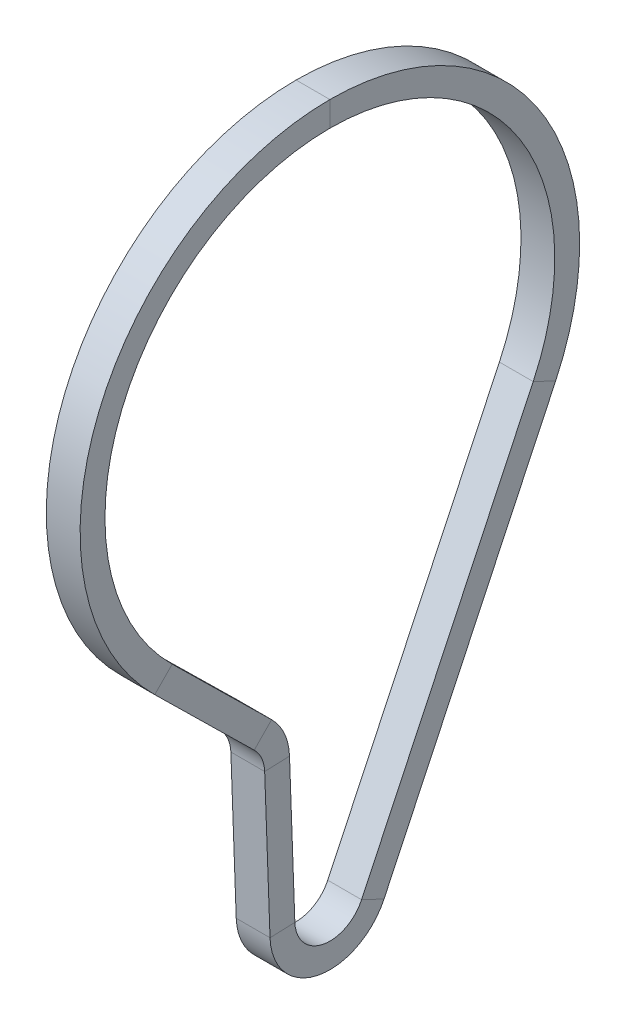
ISO-10303-21;
HEADER;
FILE_DESCRIPTION(('STEP AP214'),'2;1');
FILE_NAME('part.step','',(''),(''),'','','');
FILE_SCHEMA(('AUTOMOTIVE_DESIGN { 1 0 10303 214 1 1 1 1 }'));
ENDSEC;
DATA;
#1=APPLICATION_CONTEXT('core data for automotive mechanical design processes');
#2=APPLICATION_PROTOCOL_DEFINITION('international standard','automotive_design',2000,#1);
#3=PRODUCT_CONTEXT('',#1,'mechanical');
#4=PRODUCT('Part','Part','',(#3));
#5=PRODUCT_RELATED_PRODUCT_CATEGORY('part','',(#4));
#6=PRODUCT_DEFINITION_FORMATION('','',#4);
#7=PRODUCT_DEFINITION_CONTEXT('part definition',#1,'design');
#8=PRODUCT_DEFINITION('design','',#6,#7);
#9=PRODUCT_DEFINITION_SHAPE('','',#8);
#10=(LENGTH_UNIT() NAMED_UNIT(*) SI_UNIT(.MILLI.,.METRE.));
#11=(NAMED_UNIT(*) PLANE_ANGLE_UNIT() SI_UNIT($,.RADIAN.));
#12=(NAMED_UNIT(*) SI_UNIT($,.STERADIAN.) SOLID_ANGLE_UNIT());
#13=UNCERTAINTY_MEASURE_WITH_UNIT(LENGTH_MEASURE(1.E-05),#10,'distance_accuracy_value','');
#14=(GEOMETRIC_REPRESENTATION_CONTEXT(3) GLOBAL_UNCERTAINTY_ASSIGNED_CONTEXT((#13)) GLOBAL_UNIT_ASSIGNED_CONTEXT((#10,
#11,#12)) REPRESENTATION_CONTEXT('',''));
#15=CARTESIAN_POINT('',(0.,0.,0.));
#16=DIRECTION('',(0.,0.,1.));
#17=DIRECTION('',(1.,0.,0.));
#18=AXIS2_PLACEMENT_3D('',#15,#16,#17);
#19=CARTESIAN_POINT('',(-6.477,-68.2533357957576,67.1097191214092));
#20=DIRECTION('',(1.,0.,0.));
#21=DIRECTION('',(0.,0.,-1.));
#22=AXIS2_PLACEMENT_3D('',#19,#20,#21);
#23=PLANE('',#22);
#24=DIRECTION('',(0.,0.713055335217779,-0.70110775842053));
#25=VECTOR('',#24,1.);
#26=CARTESIAN_POINT('',(-6.477,-68.2533357957576,67.1097191214092));
#27=LINE('',#26,#25);
#28=CARTESIAN_POINT('',(-6.477,-68.2533357957576,67.1097191214092));
#29=VERTEX_POINT('',#28);
#30=CARTESIAN_POINT('',(-6.477,-61.4614837278083,60.4316677224536));
#31=VERTEX_POINT('',#30);
#32=EDGE_CURVE('E192',#29,#31,#27,.T.);
#33=ORIENTED_EDGE('',*,*,#32,.F.);
#34=CARTESIAN_POINT('',(-6.477,0.,0.));
#35=DIRECTION('',(-1.,0.,0.));
#36=DIRECTION('',(0.,-0.713055335217778,0.701107758420531));
#37=AXIS2_PLACEMENT_3D('',#34,#35,#36);
#38=CIRCLE('',#37,95.7195499770182);
#39=CARTESIAN_POINT('',(-6.477,95.7195499770182,0.));
#40=VERTEX_POINT('',#39);
#41=EDGE_CURVE('E191',#29,#40,#38,.T.);
#42=ORIENTED_EDGE('',*,*,#41,.T.);
#43=DIRECTION('',(0.,-1.,0.));
#44=VECTOR('',#43,1.);
#45=CARTESIAN_POINT('',(-6.477,95.7195499770182,0.));
#46=LINE('',#45,#44);
#47=CARTESIAN_POINT('',(-6.477,86.1945499770182,0.));
#48=VERTEX_POINT('',#47);
#49=EDGE_CURVE('E166',#40,#48,#46,.T.);
#50=ORIENTED_EDGE('',*,*,#49,.T.);
#51=CARTESIAN_POINT('',(-6.477,0.,0.));
#52=DIRECTION('',(-1.,0.,0.));
#53=DIRECTION('',(0.,-0.713055335217778,0.701107758420531));
#54=AXIS2_PLACEMENT_3D('',#51,#52,#53);
#55=CIRCLE('',#54,86.1945499770182);
#56=EDGE_CURVE('E196',#31,#48,#55,.T.);
#57=ORIENTED_EDGE('',*,*,#56,.F.);
#58=EDGE_LOOP('',(#33,#42,#50,#57));
#59=FACE_BOUND('',#58,.T.);
#60=ADVANCED_FACE('F34',(#59),#23,.F.);
#61=CARTESIAN_POINT('',(-6.477,95.7195499770182,0.));
#62=DIRECTION('',(1.,0.,0.));
#63=DIRECTION('',(0.,0.,-1.));
#64=AXIS2_PLACEMENT_3D('',#61,#62,#63);
#65=PLANE('',#64);
#66=CARTESIAN_POINT('',(-6.477,0.,0.));
#67=DIRECTION('',(-1.,0.,0.));
#68=DIRECTION('',(0.,1.,0.));
#69=AXIS2_PLACEMENT_3D('',#66,#67,#68);
#70=CIRCLE('',#69,86.1945499770182);
#71=CARTESIAN_POINT('',(-6.477,-36.8551039605418,-77.9179167958073));
#72=VERTEX_POINT('',#71);
#73=EDGE_CURVE('E172',#48,#72,#70,.T.);
#74=ORIENTED_EDGE('',*,*,#73,.F.);
#75=ORIENTED_EDGE('',*,*,#49,.F.);
#76=CARTESIAN_POINT('',(-6.477,0.,0.));
#77=DIRECTION('',(-1.,0.,0.));
#78=DIRECTION('',(0.,1.,0.));
#79=AXIS2_PLACEMENT_3D('',#76,#77,#78);
#80=CIRCLE('',#79,95.7195499770182);
#81=CARTESIAN_POINT('',(-6.477,-40.927807690856,-86.5283006040405));
#82=VERTEX_POINT('',#81);
#83=EDGE_CURVE('E170',#40,#82,#80,.T.);
#84=ORIENTED_EDGE('',*,*,#83,.T.);
#85=DIRECTION('',(0.,0.42758044412748,0.903977302701648));
#86=VECTOR('',#85,1.);
#87=CARTESIAN_POINT('',(-6.477,-40.927807690856,-86.5283006040405));
#88=LINE('',#87,#86);
#89=EDGE_CURVE('E188',#82,#72,#88,.T.);
#90=ORIENTED_EDGE('',*,*,#89,.T.);
#91=EDGE_LOOP('',(#74,#75,#84,#90));
#92=FACE_BOUND('',#91,.T.);
#93=ADVANCED_FACE('F168',(#92),#65,.F.);
#94=CARTESIAN_POINT('',(0.,0.,0.));
#95=DIRECTION('',(-1.,0.,0.));
#96=DIRECTION('',(0.,0.,1.));
#97=AXIS2_PLACEMENT_3D('',#94,#95,#96);
#98=CYLINDRICAL_SURFACE('',#97,86.1945499770182);
#99=CARTESIAN_POINT('',(6.477,0.,0.));
#100=DIRECTION('',(-1.,0.,0.));
#101=DIRECTION('',(0.,1.,0.));
#102=AXIS2_PLACEMENT_3D('',#99,#100,#101);
#103=CIRCLE('',#102,86.1945499770182);
#104=CARTESIAN_POINT('',(6.477,86.1945499770182,0.));
#105=VERTEX_POINT('',#104);
#106=CARTESIAN_POINT('',(6.477,-36.8551039605418,-77.9179167958073));
#107=VERTEX_POINT('',#106);
#108=EDGE_CURVE('E243',#105,#107,#103,.T.);
#109=ORIENTED_EDGE('',*,*,#108,.F.);
#110=DIRECTION('',(1.,0.,0.));
#111=VECTOR('',#110,1.);
#112=CARTESIAN_POINT('',(-6.477,86.1945499770182,0.));
#113=LINE('',#112,#111);
#114=EDGE_CURVE('E177',#48,#105,#113,.T.);
#115=ORIENTED_EDGE('',*,*,#114,.F.);
#116=ORIENTED_EDGE('',*,*,#73,.T.);
#117=DIRECTION('',(1.,0.,0.));
#118=VECTOR('',#117,1.);
#119=CARTESIAN_POINT('',(-6.477,-36.8551039605417,-77.9179167958073));
#120=LINE('',#119,#118);
#121=EDGE_CURVE('E289',#72,#107,#120,.T.);
#122=ORIENTED_EDGE('',*,*,#121,.T.);
#123=EDGE_LOOP('',(#109,#115,#116,#122));
#124=FACE_BOUND('',#123,.T.);
#125=ADVANCED_FACE('F317',(#124),#98,.F.);
#126=CARTESIAN_POINT('',(6.477,95.7195499770182,0.));
#127=DIRECTION('',(-1.,0.,0.));
#128=DIRECTION('',(0.,0.,1.));
#129=AXIS2_PLACEMENT_3D('',#126,#127,#128);
#130=PLANE('',#129);
#131=CARTESIAN_POINT('',(6.477,0.,0.));
#132=DIRECTION('',(-1.,0.,0.));
#133=DIRECTION('',(0.,1.,0.));
#134=AXIS2_PLACEMENT_3D('',#131,#132,#133);
#135=CIRCLE('',#134,95.7195499770182);
#136=CARTESIAN_POINT('',(6.477,95.7195499770182,0.));
#137=VERTEX_POINT('',#136);
#138=CARTESIAN_POINT('',(6.477,-40.927807690856,-86.5283006040405));
#139=VERTEX_POINT('',#138);
#140=EDGE_CURVE('E207',#137,#139,#135,.T.);
#141=ORIENTED_EDGE('',*,*,#140,.F.);
#142=DIRECTION('',(0.,1.,0.));
#143=VECTOR('',#142,1.);
#144=CARTESIAN_POINT('',(6.477,95.7195499770182,0.));
#145=LINE('',#144,#143);
#146=EDGE_CURVE('E199',#105,#137,#145,.T.);
#147=ORIENTED_EDGE('',*,*,#146,.F.);
#148=ORIENTED_EDGE('',*,*,#108,.T.);
#149=DIRECTION('',(0.,-0.42758044412748,-0.903977302701648));
#150=VECTOR('',#149,1.);
#151=CARTESIAN_POINT('',(6.477,-40.927807690856,-86.5283006040405));
#152=LINE('',#151,#150);
#153=EDGE_CURVE('E246',#107,#139,#152,.T.);
#154=ORIENTED_EDGE('',*,*,#153,.T.);
#155=EDGE_LOOP('',(#141,#147,#148,#154));
#156=FACE_BOUND('',#155,.T.);
#157=ADVANCED_FACE('F241',(#156),#130,.F.);
#158=CARTESIAN_POINT('',(0.,0.,0.));
#159=DIRECTION('',(-1.,0.,0.));
#160=DIRECTION('',(0.,0.,1.));
#161=AXIS2_PLACEMENT_3D('',#158,#159,#160);
#162=CYLINDRICAL_SURFACE('',#161,95.7195499770182);
#163=DIRECTION('',(-1.,0.,0.));
#164=VECTOR('',#163,1.);
#165=CARTESIAN_POINT('',(-6.477,-40.927807690856,-86.5283006040405));
#166=LINE('',#165,#164);
#167=EDGE_CURVE('E186',#139,#82,#166,.T.);
#168=ORIENTED_EDGE('',*,*,#167,.T.);
#169=ORIENTED_EDGE('',*,*,#83,.F.);
#170=DIRECTION('',(-1.,0.,0.));
#171=VECTOR('',#170,1.);
#172=CARTESIAN_POINT('',(-6.477,95.7195499770182,0.));
#173=LINE('',#172,#171);
#174=EDGE_CURVE('E184',#137,#40,#173,.T.);
#175=ORIENTED_EDGE('',*,*,#174,.F.);
#176=ORIENTED_EDGE('',*,*,#140,.T.);
#177=EDGE_LOOP('',(#168,#169,#175,#176));
#178=FACE_BOUND('',#177,.T.);
#179=ADVANCED_FACE('F182',(#178),#162,.T.);
#180=CARTESIAN_POINT('',(-6.477,-40.927807690856,-86.5283006040405));
#181=DIRECTION('',(1.,0.,0.));
#182=DIRECTION('',(0.,0.,-1.));
#183=AXIS2_PLACEMENT_3D('',#180,#181,#182);
#184=PLANE('',#183);
#185=DIRECTION('',(0.,-0.903977302701648,0.42758044412748));
#186=VECTOR('',#185,1.);
#187=CARTESIAN_POINT('',(-6.477,-36.8551039605417,-77.9179167958073));
#188=LINE('',#187,#186);
#189=CARTESIAN_POINT('',(-6.477,-175.921939299983,-12.1394298358682));
#190=VERTEX_POINT('',#189);
#191=EDGE_CURVE('E295',#72,#190,#188,.T.);
#192=ORIENTED_EDGE('',*,*,#191,.F.);
#193=ORIENTED_EDGE('',*,*,#89,.F.);
#194=DIRECTION('',(0.,-0.903977302701648,0.42758044412748));
#195=VECTOR('',#194,1.);
#196=CARTESIAN_POINT('',(-6.477,-40.927807690856,-86.5283006040405));
#197=LINE('',#196,#195);
#198=CARTESIAN_POINT('',(-6.477,-179.994643030297,-20.7498136441014));
#199=VERTEX_POINT('',#198);
#200=EDGE_CURVE('E206',#82,#199,#197,.T.);
#201=ORIENTED_EDGE('',*,*,#200,.T.);
#202=DIRECTION('',(0.,0.42758044412748,0.903977302701648));
#203=VECTOR('',#202,1.);
#204=CARTESIAN_POINT('',(-6.477,-179.994643030297,-20.7498136441014));
#205=LINE('',#204,#203);
#206=EDGE_CURVE('E335',#199,#190,#205,.T.);
#207=ORIENTED_EDGE('',*,*,#206,.T.);
#208=EDGE_LOOP('',(#192,#193,#201,#207));
#209=FACE_BOUND('',#208,.T.);
#210=ADVANCED_FACE('F386',(#209),#184,.F.);
#211=CARTESIAN_POINT('',(-6.477,-36.8551039605417,-77.9179167958073));
#212=DIRECTION('',(0.,-0.42758044412748,-0.903977302701648));
#213=DIRECTION('',(0.,0.903977302701648,-0.42758044412748));
#214=AXIS2_PLACEMENT_3D('',#211,#212,#213);
#215=PLANE('',#214);
#216=DIRECTION('',(0.,-0.903977302701648,0.42758044412748));
#217=VECTOR('',#216,1.);
#218=CARTESIAN_POINT('',(6.477,-36.8551039605417,-77.9179167958073));
#219=LINE('',#218,#217);
#220=CARTESIAN_POINT('',(6.477,-175.921939299983,-12.1394298358682));
#221=VERTEX_POINT('',#220);
#222=EDGE_CURVE('E254',#107,#221,#219,.T.);
#223=ORIENTED_EDGE('',*,*,#222,.F.);
#224=ORIENTED_EDGE('',*,*,#121,.F.);
#225=ORIENTED_EDGE('',*,*,#191,.T.);
#226=DIRECTION('',(1.,0.,0.));
#227=VECTOR('',#226,1.);
#228=CARTESIAN_POINT('',(-6.477,-175.921939299983,-12.1394298358682));
#229=LINE('',#228,#227);
#230=EDGE_CURVE('E292',#190,#221,#229,.T.);
#231=ORIENTED_EDGE('',*,*,#230,.T.);
#232=EDGE_LOOP('',(#223,#224,#225,#231));
#233=FACE_BOUND('',#232,.T.);
#234=ADVANCED_FACE('F321',(#233),#215,.F.);
#235=CARTESIAN_POINT('',(6.477,-40.927807690856,-86.5283006040405));
#236=DIRECTION('',(-1.,0.,0.));
#237=DIRECTION('',(0.,0.,1.));
#238=AXIS2_PLACEMENT_3D('',#235,#236,#237);
#239=PLANE('',#238);
#240=DIRECTION('',(0.,-0.903977302701648,0.42758044412748));
#241=VECTOR('',#240,1.);
#242=CARTESIAN_POINT('',(6.477,-40.927807690856,-86.5283006040405));
#243=LINE('',#242,#241);
#244=CARTESIAN_POINT('',(6.477,-179.994643030297,-20.7498136441014));
#245=VERTEX_POINT('',#244);
#246=EDGE_CURVE('E212',#139,#245,#243,.T.);
#247=ORIENTED_EDGE('',*,*,#246,.F.);
#248=ORIENTED_EDGE('',*,*,#153,.F.);
#249=ORIENTED_EDGE('',*,*,#222,.T.);
#250=DIRECTION('',(0.,-0.42758044412748,-0.903977302701648));
#251=VECTOR('',#250,1.);
#252=CARTESIAN_POINT('',(6.477,-179.994643030297,-20.7498136441014));
#253=LINE('',#252,#251);
#254=EDGE_CURVE('E251',#221,#245,#253,.T.);
#255=ORIENTED_EDGE('',*,*,#254,.T.);
#256=EDGE_LOOP('',(#247,#248,#249,#255));
#257=FACE_BOUND('',#256,.T.);
#258=ADVANCED_FACE('F325',(#257),#239,.F.);
#259=CARTESIAN_POINT('',(-6.477,-40.927807690856,-86.5283006040405));
#260=DIRECTION('',(0.,0.42758044412748,0.903977302701648));
#261=DIRECTION('',(0.,-0.903977302701648,0.42758044412748));
#262=AXIS2_PLACEMENT_3D('',#259,#260,#261);
#263=PLANE('',#262);
#264=DIRECTION('',(-1.,0.,0.));
#265=VECTOR('',#264,1.);
#266=CARTESIAN_POINT('',(-6.477,-179.994643030297,-20.7498136441014));
#267=LINE('',#266,#265);
#268=EDGE_CURVE('E208',#245,#199,#267,.T.);
#269=ORIENTED_EDGE('',*,*,#268,.T.);
#270=ORIENTED_EDGE('',*,*,#200,.F.);
#271=ORIENTED_EDGE('',*,*,#167,.F.);
#272=ORIENTED_EDGE('',*,*,#246,.T.);
#273=EDGE_LOOP('',(#269,#270,#271,#272));
#274=FACE_BOUND('',#273,.T.);
#275=ADVANCED_FACE('F329',(#274),#263,.F.);
#276=CARTESIAN_POINT('',(-6.477,-179.994643030297,-20.7498136441014));
#277=DIRECTION('',(1.,0.,0.));
#278=DIRECTION('',(0.,0.,-1.));
#279=AXIS2_PLACEMENT_3D('',#276,#277,#278);
#280=PLANE('',#279);
#281=CARTESIAN_POINT('',(-6.477,-170.18,0.));
#282=DIRECTION('',(-1.,0.,0.));
#283=DIRECTION('',(0.,-0.427580444127481,-0.903977302701647));
#284=AXIS2_PLACEMENT_3D('',#281,#282,#283);
#285=CIRCLE('',#284,13.4289099954036);
#286=CARTESIAN_POINT('',(-6.477,-170.669696585711,13.4199784246695));
#287=VERTEX_POINT('',#286);
#288=EDGE_CURVE('E300',#190,#287,#285,.T.);
#289=ORIENTED_EDGE('',*,*,#288,.F.);
#290=ORIENTED_EDGE('',*,*,#206,.F.);
#291=CARTESIAN_POINT('',(-6.477,-170.18,0.));
#292=DIRECTION('',(-1.,0.,0.));
#293=DIRECTION('',(0.,-0.42758044412748,-0.903977302701648));
#294=AXIS2_PLACEMENT_3D('',#291,#292,#293);
#295=CIRCLE('',#294,22.9539099954036);
#296=CARTESIAN_POINT('',(-6.477,-171.017033784374,22.9386433452571));
#297=VERTEX_POINT('',#296);
#298=EDGE_CURVE('E211',#199,#297,#295,.T.);
#299=ORIENTED_EDGE('',*,*,#298,.T.);
#300=DIRECTION('',(0.,0.0364658476286414,-0.999334899799224));
#301=VECTOR('',#300,1.);
#302=CARTESIAN_POINT('',(-6.477,-171.017033784374,22.9386433452571));
#303=LINE('',#302,#301);
#304=EDGE_CURVE('E261',#297,#287,#303,.T.);
#305=ORIENTED_EDGE('',*,*,#304,.T.);
#306=EDGE_LOOP('',(#289,#290,#299,#305));
#307=FACE_BOUND('',#306,.T.);
#308=ADVANCED_FACE('F359',(#307),#280,.F.);
#309=CARTESIAN_POINT('',(0.,-170.18,0.));
#310=DIRECTION('',(-1.,0.,0.));
#311=DIRECTION('',(0.,0.,1.));
#312=AXIS2_PLACEMENT_3D('',#309,#310,#311);
#313=CYLINDRICAL_SURFACE('',#312,13.4289099954036);
#314=CARTESIAN_POINT('',(6.477,-170.18,0.));
#315=DIRECTION('',(-1.,0.,0.));
#316=DIRECTION('',(0.,-0.427580444127481,-0.903977302701647));
#317=AXIS2_PLACEMENT_3D('',#314,#315,#316);
#318=CIRCLE('',#317,13.4289099954036);
#319=CARTESIAN_POINT('',(6.477,-170.669696585711,13.4199784246695));
#320=VERTEX_POINT('',#319);
#321=EDGE_CURVE('E262',#221,#320,#318,.T.);
#322=ORIENTED_EDGE('',*,*,#321,.F.);
#323=ORIENTED_EDGE('',*,*,#230,.F.);
#324=ORIENTED_EDGE('',*,*,#288,.T.);
#325=DIRECTION('',(1.,0.,0.));
#326=VECTOR('',#325,1.);
#327=CARTESIAN_POINT('',(-6.477,-170.669696585711,13.4199784246695));
#328=LINE('',#327,#326);
#329=EDGE_CURVE('E258',#287,#320,#328,.T.);
#330=ORIENTED_EDGE('',*,*,#329,.T.);
#331=EDGE_LOOP('',(#322,#323,#324,#330));
#332=FACE_BOUND('',#331,.T.);
#333=ADVANCED_FACE('F356',(#332),#313,.F.);
#334=CARTESIAN_POINT('',(6.477,-179.994643030297,-20.7498136441014));
#335=DIRECTION('',(-1.,0.,0.));
#336=DIRECTION('',(0.,0.,1.));
#337=AXIS2_PLACEMENT_3D('',#334,#335,#336);
#338=PLANE('',#337);
#339=CARTESIAN_POINT('',(6.477,-170.18,0.));
#340=DIRECTION('',(-1.,0.,0.));
#341=DIRECTION('',(0.,-0.42758044412748,-0.903977302701648));
#342=AXIS2_PLACEMENT_3D('',#339,#340,#341);
#343=CIRCLE('',#342,22.9539099954036);
#344=CARTESIAN_POINT('',(6.477,-171.017033784374,22.9386433452571));
#345=VERTEX_POINT('',#344);
#346=EDGE_CURVE('E259',#245,#345,#343,.T.);
#347=ORIENTED_EDGE('',*,*,#346,.F.);
#348=ORIENTED_EDGE('',*,*,#254,.F.);
#349=ORIENTED_EDGE('',*,*,#321,.T.);
#350=DIRECTION('',(0.,-0.0364658476286414,0.999334899799224));
#351=VECTOR('',#350,1.);
#352=CARTESIAN_POINT('',(6.477,-171.017033784374,22.9386433452571));
#353=LINE('',#352,#351);
#354=EDGE_CURVE('E217',#320,#345,#353,.T.);
#355=ORIENTED_EDGE('',*,*,#354,.T.);
#356=EDGE_LOOP('',(#347,#348,#349,#355));
#357=FACE_BOUND('',#356,.T.);
#358=ADVANCED_FACE('F354',(#357),#338,.F.);
#359=CARTESIAN_POINT('',(0.,-170.18,0.));
#360=DIRECTION('',(-1.,0.,0.));
#361=DIRECTION('',(0.,0.,1.));
#362=AXIS2_PLACEMENT_3D('',#359,#360,#361);
#363=CYLINDRICAL_SURFACE('',#362,22.9539099954036);
#364=DIRECTION('',(-1.,0.,0.));
#365=VECTOR('',#364,1.);
#366=CARTESIAN_POINT('',(-6.477,-171.017033784374,22.9386433452571));
#367=LINE('',#366,#365);
#368=EDGE_CURVE('E213',#345,#297,#367,.T.);
#369=ORIENTED_EDGE('',*,*,#368,.T.);
#370=ORIENTED_EDGE('',*,*,#298,.F.);
#371=ORIENTED_EDGE('',*,*,#268,.F.);
#372=ORIENTED_EDGE('',*,*,#346,.T.);
#373=EDGE_LOOP('',(#369,#370,#371,#372));
#374=FACE_BOUND('',#373,.T.);
#375=ADVANCED_FACE('F361',(#374),#363,.T.);
#376=CARTESIAN_POINT('',(-6.477,-171.017033784374,22.9386433452571));
#377=DIRECTION('',(1.,0.,0.));
#378=DIRECTION('',(0.,0.,-1.));
#379=AXIS2_PLACEMENT_3D('',#376,#377,#378);
#380=PLANE('',#379);
#381=DIRECTION('',(0.,0.999334899799224,0.0364658476286407));
#382=VECTOR('',#381,1.);
#383=CARTESIAN_POINT('',(-6.477,-170.669696585711,13.4199784246695));
#384=LINE('',#383,#382);
#385=CARTESIAN_POINT('',(-6.477,-114.468643373685,15.4707614438662));
#386=VERTEX_POINT('',#385);
#387=EDGE_CURVE('E143',#287,#386,#384,.T.);
#388=ORIENTED_EDGE('',*,*,#387,.F.);
#389=ORIENTED_EDGE('',*,*,#304,.F.);
#390=DIRECTION('',(0.,0.999334899799224,0.0364658476286407));
#391=VECTOR('',#390,1.);
#392=CARTESIAN_POINT('',(-6.477,-171.017033784374,22.9386433452571));
#393=LINE('',#392,#391);
#394=CARTESIAN_POINT('',(-6.477,-114.815980572348,24.9894263644538));
#395=VERTEX_POINT('',#394);
#396=EDGE_CURVE('E216',#297,#395,#393,.T.);
#397=ORIENTED_EDGE('',*,*,#396,.T.);
#398=DIRECTION('',(0.,0.0364658476286405,-0.999334899799224));
#399=VECTOR('',#398,1.);
#400=CARTESIAN_POINT('',(-6.477,-114.815980572348,24.9894263644538));
#401=LINE('',#400,#399);
#402=EDGE_CURVE('E344',#395,#386,#401,.T.);
#403=ORIENTED_EDGE('',*,*,#402,.T.);
#404=EDGE_LOOP('',(#388,#389,#397,#403));
#405=FACE_BOUND('',#404,.T.);
#406=ADVANCED_FACE('F349',(#405),#380,.F.);
#407=CARTESIAN_POINT('',(-6.477,-170.669696585711,13.4199784246695));
#408=DIRECTION('',(0.,-0.0364658476286406,0.999334899799224));
#409=DIRECTION('',(0.,-0.999334899799224,-0.0364658476286406));
#410=AXIS2_PLACEMENT_3D('',#407,#408,#409);
#411=PLANE('',#410);
#412=DIRECTION('',(0.,0.999334899799224,0.0364658476286407));
#413=VECTOR('',#412,1.);
#414=CARTESIAN_POINT('',(6.477,-170.669696585711,13.4199784246695));
#415=LINE('',#414,#413);
#416=CARTESIAN_POINT('',(6.477,-114.468643373685,15.4707614438662));
#417=VERTEX_POINT('',#416);
#418=EDGE_CURVE('E137',#320,#417,#415,.T.);
#419=ORIENTED_EDGE('',*,*,#418,.F.);
#420=ORIENTED_EDGE('',*,*,#329,.F.);
#421=ORIENTED_EDGE('',*,*,#387,.T.);
#422=DIRECTION('',(1.,0.,0.));
#423=VECTOR('',#422,1.);
#424=CARTESIAN_POINT('',(-6.477,-114.468643373685,15.4707614438662));
#425=LINE('',#424,#423);
#426=EDGE_CURVE('E301',#386,#417,#425,.T.);
#427=ORIENTED_EDGE('',*,*,#426,.T.);
#428=EDGE_LOOP('',(#419,#420,#421,#427));
#429=FACE_BOUND('',#428,.T.);
#430=ADVANCED_FACE('F352',(#429),#411,.F.);
#431=CARTESIAN_POINT('',(6.477,-171.017033784374,22.9386433452571));
#432=DIRECTION('',(-1.,0.,0.));
#433=DIRECTION('',(0.,0.,1.));
#434=AXIS2_PLACEMENT_3D('',#431,#432,#433);
#435=PLANE('',#434);
#436=DIRECTION('',(0.,0.999334899799224,0.0364658476286407));
#437=VECTOR('',#436,1.);
#438=CARTESIAN_POINT('',(6.477,-171.017033784374,22.9386433452571));
#439=LINE('',#438,#437);
#440=CARTESIAN_POINT('',(6.477,-114.815980572348,24.9894263644538));
#441=VERTEX_POINT('',#440);
#442=EDGE_CURVE('E221',#345,#441,#439,.T.);
#443=ORIENTED_EDGE('',*,*,#442,.F.);
#444=ORIENTED_EDGE('',*,*,#354,.F.);
#445=ORIENTED_EDGE('',*,*,#418,.T.);
#446=DIRECTION('',(0.,-0.0364658476286405,0.999334899799224));
#447=VECTOR('',#446,1.);
#448=CARTESIAN_POINT('',(6.477,-114.815980572348,24.9894263644538));
#449=LINE('',#448,#447);
#450=EDGE_CURVE('E263',#417,#441,#449,.T.);
#451=ORIENTED_EDGE('',*,*,#450,.T.);
#452=EDGE_LOOP('',(#443,#444,#445,#451));
#453=FACE_BOUND('',#452,.T.);
#454=ADVANCED_FACE('F269',(#453),#435,.F.);
#455=CARTESIAN_POINT('',(-6.477,-171.017033784374,22.9386433452571));
#456=DIRECTION('',(0.,0.0364658476286406,-0.999334899799224));
#457=DIRECTION('',(0.,0.999334899799224,0.0364658476286406));
#458=AXIS2_PLACEMENT_3D('',#455,#456,#457);
#459=PLANE('',#458);
#460=DIRECTION('',(-1.,0.,0.));
#461=VECTOR('',#460,1.);
#462=CARTESIAN_POINT('',(-6.477,-114.815980572348,24.9894263644538));
#463=LINE('',#462,#461);
#464=EDGE_CURVE('E218',#441,#395,#463,.T.);
#465=ORIENTED_EDGE('',*,*,#464,.T.);
#466=ORIENTED_EDGE('',*,*,#396,.F.);
#467=ORIENTED_EDGE('',*,*,#368,.F.);
#468=ORIENTED_EDGE('',*,*,#442,.T.);
#469=EDGE_LOOP('',(#465,#466,#467,#468));
#470=FACE_BOUND('',#469,.T.);
#471=ADVANCED_FACE('F267',(#470),#459,.F.);
#472=CARTESIAN_POINT('',(-6.477,-114.815980572348,24.9894263644538));
#473=DIRECTION('',(1.,0.,0.));
#474=DIRECTION('',(0.,0.,-1.));
#475=AXIS2_PLACEMENT_3D('',#472,#473,#474);
#476=PLANE('',#475);
#477=CARTESIAN_POINT('',(-6.477,-115.305677158059,38.4094047891233));
#478=DIRECTION('',(1.,0.,0.));
#479=DIRECTION('',(0.,0.0364658476286422,-0.999334899799224));
#480=AXIS2_PLACEMENT_3D('',#477,#478,#479);
#481=CIRCLE('',#480,22.9539099954036);
#482=CARTESIAN_POINT('',(-6.477,-98.9382691717278,22.3162404052592));
#483=VERTEX_POINT('',#482);
#484=EDGE_CURVE('E114',#386,#483,#481,.T.);
#485=ORIENTED_EDGE('',*,*,#484,.F.);
#486=ORIENTED_EDGE('',*,*,#402,.F.);
#487=CARTESIAN_POINT('',(-6.477,-115.305677158059,38.4094047891233));
#488=DIRECTION('',(1.,0.,0.));
#489=DIRECTION('',(0.,0.0364658476286426,-0.999334899799224));
#490=AXIS2_PLACEMENT_3D('',#487,#488,#489);
#491=CIRCLE('',#490,13.4289099954036);
#492=CARTESIAN_POINT('',(-6.477,-105.730121239677,28.9942918042148));
#493=VERTEX_POINT('',#492);
#494=EDGE_CURVE('E220',#395,#493,#491,.T.);
#495=ORIENTED_EDGE('',*,*,#494,.T.);
#496=DIRECTION('',(0.,0.713055335217779,-0.701107758420531));
#497=VECTOR('',#496,1.);
#498=CARTESIAN_POINT('',(-6.477,-105.730121239677,28.9942918042148));
#499=LINE('',#498,#497);
#500=EDGE_CURVE('E275',#493,#483,#499,.T.);
#501=ORIENTED_EDGE('',*,*,#500,.T.);
#502=EDGE_LOOP('',(#485,#486,#495,#501));
#503=FACE_BOUND('',#502,.T.);
#504=ADVANCED_FACE('F350',(#503),#476,.F.);
#505=CARTESIAN_POINT('',(0.,-115.305677158059,38.4094047891233));
#506=DIRECTION('',(1.,0.,0.));
#507=DIRECTION('',(0.,0.,-1.));
#508=AXIS2_PLACEMENT_3D('',#505,#506,#507);
#509=CYLINDRICAL_SURFACE('',#508,22.9539099954036);
#510=CARTESIAN_POINT('',(6.477,-115.305677158059,38.4094047891233));
#511=DIRECTION('',(1.,0.,0.));
#512=DIRECTION('',(0.,0.0364658476286422,-0.999334899799224));
#513=AXIS2_PLACEMENT_3D('',#510,#511,#512);
#514=CIRCLE('',#513,22.9539099954036);
#515=CARTESIAN_POINT('',(6.477,-98.9382691717278,22.3162404052592));
#516=VERTEX_POINT('',#515);
#517=EDGE_CURVE('E107',#417,#516,#514,.T.);
#518=ORIENTED_EDGE('',*,*,#517,.F.);
#519=ORIENTED_EDGE('',*,*,#426,.F.);
#520=ORIENTED_EDGE('',*,*,#484,.T.);
#521=DIRECTION('',(1.,0.,0.));
#522=VECTOR('',#521,1.);
#523=CARTESIAN_POINT('',(-6.477,-98.9382691717278,22.3162404052592));
#524=LINE('',#523,#522);
#525=EDGE_CURVE('E304',#483,#516,#524,.T.);
#526=ORIENTED_EDGE('',*,*,#525,.T.);
#527=EDGE_LOOP('',(#518,#519,#520,#526));
#528=FACE_BOUND('',#527,.T.);
#529=ADVANCED_FACE('F351',(#528),#509,.T.);
#530=CARTESIAN_POINT('',(6.477,-114.815980572348,24.9894263644538));
#531=DIRECTION('',(-1.,0.,0.));
#532=DIRECTION('',(0.,0.,1.));
#533=AXIS2_PLACEMENT_3D('',#530,#531,#532);
#534=PLANE('',#533);
#535=CARTESIAN_POINT('',(6.477,-115.305677158059,38.4094047891233));
#536=DIRECTION('',(1.,0.,0.));
#537=DIRECTION('',(0.,0.0364658476286426,-0.999334899799224));
#538=AXIS2_PLACEMENT_3D('',#535,#536,#537);
#539=CIRCLE('',#538,13.4289099954036);
#540=CARTESIAN_POINT('',(6.477,-105.730121239677,28.9942918042148));
#541=VERTEX_POINT('',#540);
#542=EDGE_CURVE('E98',#441,#541,#539,.T.);
#543=ORIENTED_EDGE('',*,*,#542,.F.);
#544=ORIENTED_EDGE('',*,*,#450,.F.);
#545=ORIENTED_EDGE('',*,*,#517,.T.);
#546=DIRECTION('',(0.,-0.713055335217779,0.701107758420531));
#547=VECTOR('',#546,1.);
#548=CARTESIAN_POINT('',(6.477,-105.730121239677,28.9942918042148));
#549=LINE('',#548,#547);
#550=EDGE_CURVE('E227',#516,#541,#549,.T.);
#551=ORIENTED_EDGE('',*,*,#550,.T.);
#552=EDGE_LOOP('',(#543,#544,#545,#551));
#553=FACE_BOUND('',#552,.T.);
#554=ADVANCED_FACE('F270',(#553),#534,.F.);
#555=CARTESIAN_POINT('',(0.,-115.305677158059,38.4094047891233));
#556=DIRECTION('',(1.,0.,0.));
#557=DIRECTION('',(0.,0.,-1.));
#558=AXIS2_PLACEMENT_3D('',#555,#556,#557);
#559=CYLINDRICAL_SURFACE('',#558,13.4289099954036);
#560=DIRECTION('',(-1.,0.,0.));
#561=VECTOR('',#560,1.);
#562=CARTESIAN_POINT('',(-6.477,-105.730121239677,28.9942918042148));
#563=LINE('',#562,#561);
#564=EDGE_CURVE('E222',#541,#493,#563,.T.);
#565=ORIENTED_EDGE('',*,*,#564,.T.);
#566=ORIENTED_EDGE('',*,*,#494,.F.);
#567=ORIENTED_EDGE('',*,*,#464,.F.);
#568=ORIENTED_EDGE('',*,*,#542,.T.);
#569=EDGE_LOOP('',(#565,#566,#567,#568));
#570=FACE_BOUND('',#569,.T.);
#571=ADVANCED_FACE('F271',(#570),#559,.F.);
#572=CARTESIAN_POINT('',(-6.477,-105.730121239677,28.9942918042148));
#573=DIRECTION('',(1.,0.,0.));
#574=DIRECTION('',(0.,1.,0.));
#575=AXIS2_PLACEMENT_3D('',#572,#573,#574);
#576=PLANE('',#575);
#577=DIRECTION('',(0.,0.70110775842053,0.713055335217779));
#578=VECTOR('',#577,1.);
#579=CARTESIAN_POINT('',(-6.477,-98.9382691717278,22.3162404052592));
#580=LINE('',#579,#578);
#581=EDGE_CURVE('E281',#483,#31,#580,.T.);
#582=ORIENTED_EDGE('',*,*,#581,.F.);
#583=ORIENTED_EDGE('',*,*,#500,.F.);
#584=DIRECTION('',(0.,0.70110775842053,0.713055335217779));
#585=VECTOR('',#584,1.);
#586=CARTESIAN_POINT('',(-6.477,-105.730121239677,28.9942918042148));
#587=LINE('',#586,#585);
#588=EDGE_CURVE('E223',#493,#29,#587,.T.);
#589=ORIENTED_EDGE('',*,*,#588,.T.);
#590=ORIENTED_EDGE('',*,*,#32,.T.);
#591=EDGE_LOOP('',(#582,#583,#589,#590));
#592=FACE_BOUND('',#591,.T.);
#593=ADVANCED_FACE('F380',(#592),#576,.F.);
#594=CARTESIAN_POINT('',(-6.477,-98.9382691717278,22.3162404052592));
#595=DIRECTION('',(0.,-0.713055335217779,0.70110775842053));
#596=DIRECTION('',(0.,-0.70110775842053,-0.713055335217779));
#597=AXIS2_PLACEMENT_3D('',#594,#595,#596);
#598=PLANE('',#597);
#599=DIRECTION('',(0.,0.70110775842053,0.713055335217779));
#600=VECTOR('',#599,1.);
#601=CARTESIAN_POINT('',(6.477,-98.9382691717278,22.3162404052592));
#602=LINE('',#601,#600);
#603=CARTESIAN_POINT('',(6.477,-61.4614837278083,60.4316677224536));
#604=VERTEX_POINT('',#603);
#605=EDGE_CURVE('E59',#516,#604,#602,.T.);
#606=ORIENTED_EDGE('',*,*,#605,.F.);
#607=ORIENTED_EDGE('',*,*,#525,.F.);
#608=ORIENTED_EDGE('',*,*,#581,.T.);
#609=DIRECTION('',(1.,0.,0.));
#610=VECTOR('',#609,1.);
#611=CARTESIAN_POINT('',(-6.477,-61.4614837278083,60.4316677224536));
#612=LINE('',#611,#610);
#613=EDGE_CURVE('E283',#31,#604,#612,.T.);
#614=ORIENTED_EDGE('',*,*,#613,.T.);
#615=EDGE_LOOP('',(#606,#607,#608,#614));
#616=FACE_BOUND('',#615,.T.);
#617=ADVANCED_FACE('F311',(#616),#598,.F.);
#618=CARTESIAN_POINT('',(6.477,-105.730121239677,28.9942918042148));
#619=DIRECTION('',(-1.,0.,0.));
#620=DIRECTION('',(0.,-1.,0.));
#621=AXIS2_PLACEMENT_3D('',#618,#619,#620);
#622=PLANE('',#621);
#623=DIRECTION('',(0.,0.70110775842053,0.713055335217779));
#624=VECTOR('',#623,1.);
#625=CARTESIAN_POINT('',(6.477,-105.730121239677,28.9942918042148));
#626=LINE('',#625,#624);
#627=CARTESIAN_POINT('',(6.477,-68.2533357957576,67.1097191214092));
#628=VERTEX_POINT('',#627);
#629=EDGE_CURVE('E51',#541,#628,#626,.T.);
#630=ORIENTED_EDGE('',*,*,#629,.F.);
#631=ORIENTED_EDGE('',*,*,#550,.F.);
#632=ORIENTED_EDGE('',*,*,#605,.T.);
#633=DIRECTION('',(0.,-0.713055335217779,0.70110775842053));
#634=VECTOR('',#633,1.);
#635=CARTESIAN_POINT('',(6.477,-68.2533357957576,67.1097191214092));
#636=LINE('',#635,#634);
#637=EDGE_CURVE('E232',#604,#628,#636,.T.);
#638=ORIENTED_EDGE('',*,*,#637,.T.);
#639=EDGE_LOOP('',(#630,#631,#632,#638));
#640=FACE_BOUND('',#639,.T.);
#641=ADVANCED_FACE('F395',(#640),#622,.F.);
#642=CARTESIAN_POINT('',(-6.477,-105.730121239677,28.9942918042148));
#643=DIRECTION('',(0.,0.713055335217779,-0.70110775842053));
#644=DIRECTION('',(0.,0.70110775842053,0.713055335217779));
#645=AXIS2_PLACEMENT_3D('',#642,#643,#644);
#646=PLANE('',#645);
#647=DIRECTION('',(-1.,0.,0.));
#648=VECTOR('',#647,1.);
#649=CARTESIAN_POINT('',(-6.477,-68.2533357957576,67.1097191214092));
#650=LINE('',#649,#648);
#651=EDGE_CURVE('E38',#628,#29,#650,.T.);
#652=ORIENTED_EDGE('',*,*,#651,.T.);
#653=ORIENTED_EDGE('',*,*,#588,.F.);
#654=ORIENTED_EDGE('',*,*,#564,.F.);
#655=ORIENTED_EDGE('',*,*,#629,.T.);
#656=EDGE_LOOP('',(#652,#653,#654,#655));
#657=FACE_BOUND('',#656,.T.);
#658=ADVANCED_FACE('F233',(#657),#646,.F.);
#659=CARTESIAN_POINT('',(0.,0.,0.));
#660=DIRECTION('',(-1.,0.,0.));
#661=DIRECTION('',(0.,0.,1.));
#662=AXIS2_PLACEMENT_3D('',#659,#660,#661);
#663=CYLINDRICAL_SURFACE('',#662,86.1945499770182);
#664=ORIENTED_EDGE('',*,*,#56,.T.);
#665=ORIENTED_EDGE('',*,*,#114,.T.);
#666=CARTESIAN_POINT('',(6.477,0.,0.));
#667=DIRECTION('',(-1.,0.,0.));
#668=DIRECTION('',(0.,-0.713055335217778,0.701107758420531));
#669=AXIS2_PLACEMENT_3D('',#666,#667,#668);
#670=CIRCLE('',#669,86.1945499770182);
#671=EDGE_CURVE('E43',#604,#105,#670,.T.);
#672=ORIENTED_EDGE('',*,*,#671,.F.);
#673=ORIENTED_EDGE('',*,*,#613,.F.);
#674=EDGE_LOOP('',(#664,#665,#672,#673));
#675=FACE_BOUND('',#674,.T.);
#676=ADVANCED_FACE('F315',(#675),#663,.F.);
#677=CARTESIAN_POINT('',(6.477,-68.2533357957576,67.1097191214092));
#678=DIRECTION('',(-1.,0.,0.));
#679=DIRECTION('',(0.,0.,1.));
#680=AXIS2_PLACEMENT_3D('',#677,#678,#679);
#681=PLANE('',#680);
#682=ORIENTED_EDGE('',*,*,#671,.T.);
#683=ORIENTED_EDGE('',*,*,#146,.T.);
#684=CARTESIAN_POINT('',(6.477,0.,0.));
#685=DIRECTION('',(-1.,0.,0.));
#686=DIRECTION('',(0.,-0.713055335217778,0.701107758420531));
#687=AXIS2_PLACEMENT_3D('',#684,#685,#686);
#688=CIRCLE('',#687,95.7195499770182);
#689=EDGE_CURVE('E11',#628,#137,#688,.T.);
#690=ORIENTED_EDGE('',*,*,#689,.F.);
#691=ORIENTED_EDGE('',*,*,#637,.F.);
#692=EDGE_LOOP('',(#682,#683,#690,#691));
#693=FACE_BOUND('',#692,.T.);
#694=ADVANCED_FACE('F237',(#693),#681,.F.);
#695=CARTESIAN_POINT('',(0.,0.,0.));
#696=DIRECTION('',(-1.,0.,0.));
#697=DIRECTION('',(0.,0.,1.));
#698=AXIS2_PLACEMENT_3D('',#695,#696,#697);
#699=CYLINDRICAL_SURFACE('',#698,95.7195499770182);
#700=ORIENTED_EDGE('',*,*,#689,.T.);
#701=ORIENTED_EDGE('',*,*,#174,.T.);
#702=ORIENTED_EDGE('',*,*,#41,.F.);
#703=ORIENTED_EDGE('',*,*,#651,.F.);
#704=EDGE_LOOP('',(#700,#701,#702,#703));
#705=FACE_BOUND('',#704,.T.);
#706=ADVANCED_FACE('F36',(#705),#699,.T.);
#707=CLOSED_SHELL('',(#60,#93,#125,#157,#179,#210,#234,#258,#275,#308,#333,#358,#375,#406,#430,
#454,#471,#504,#529,#554,#571,#593,#617,#641,#658,#676,#694,#706));
#708=MANIFOLD_SOLID_BREP('B2',#707);
#709=ADVANCED_BREP_SHAPE_REPRESENTATION('',(#18,#708),#14);
#710=SHAPE_DEFINITION_REPRESENTATION(#9,#709);
ENDSEC;
END-ISO-10303-21;
